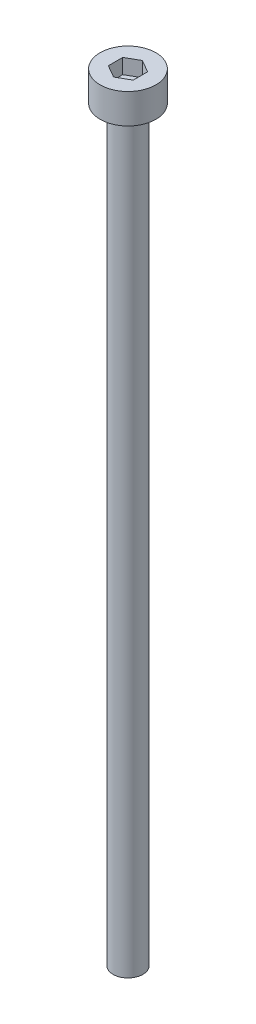
ISO-10303-21;
HEADER;
FILE_DESCRIPTION(('STEP AP214'),'2;1');
FILE_NAME('part.step','',(''),(''),'','','');
FILE_SCHEMA(('AUTOMOTIVE_DESIGN { 1 0 10303 214 1 1 1 1 }'));
ENDSEC;
DATA;
#1=APPLICATION_CONTEXT('core data for automotive mechanical design processes');
#2=APPLICATION_PROTOCOL_DEFINITION('international standard','automotive_design',2000,#1);
#3=PRODUCT_CONTEXT('',#1,'mechanical');
#4=PRODUCT('Part','Part','',(#3));
#5=PRODUCT_RELATED_PRODUCT_CATEGORY('part','',(#4));
#6=PRODUCT_DEFINITION_FORMATION('','',#4);
#7=PRODUCT_DEFINITION_CONTEXT('part definition',#1,'design');
#8=PRODUCT_DEFINITION('design','',#6,#7);
#9=PRODUCT_DEFINITION_SHAPE('','',#8);
#10=(LENGTH_UNIT() NAMED_UNIT(*) SI_UNIT(.MILLI.,.METRE.));
#11=(NAMED_UNIT(*) PLANE_ANGLE_UNIT() SI_UNIT($,.RADIAN.));
#12=(NAMED_UNIT(*) SI_UNIT($,.STERADIAN.) SOLID_ANGLE_UNIT());
#13=UNCERTAINTY_MEASURE_WITH_UNIT(LENGTH_MEASURE(1.E-05),#10,'distance_accuracy_value','');
#14=(GEOMETRIC_REPRESENTATION_CONTEXT(3) GLOBAL_UNCERTAINTY_ASSIGNED_CONTEXT((#13)) GLOBAL_UNIT_ASSIGNED_CONTEXT((#10,
#11,#12)) REPRESENTATION_CONTEXT('',''));
#15=CARTESIAN_POINT('',(0.,0.,0.));
#16=DIRECTION('',(0.,0.,1.));
#17=DIRECTION('',(1.,0.,0.));
#18=AXIS2_PLACEMENT_3D('',#15,#16,#17);
#19=CARTESIAN_POINT('',(0.,3.,0.));
#20=DIRECTION('',(0.,1.,0.));
#21=DIRECTION('',(0.,0.,1.));
#22=AXIS2_PLACEMENT_3D('',#19,#20,#21);
#23=PLANE('',#22);
#24=CARTESIAN_POINT('',(0.,3.,0.));
#25=DIRECTION('',(0.,1.,0.));
#26=DIRECTION('',(0.,0.,1.));
#27=AXIS2_PLACEMENT_3D('',#24,#25,#26);
#28=CIRCLE('',#27,2.8);
#29=CARTESIAN_POINT('',(0.,3.,2.8));
#30=VERTEX_POINT('',#29);
#31=EDGE_CURVE('E55',#30,#30,#28,.T.);
#32=ORIENTED_EDGE('',*,*,#31,.T.);
#33=EDGE_LOOP('',(#32));
#34=FACE_BOUND('',#33,.T.);
#35=DIRECTION('',(0.,0.,-1.));
#36=VECTOR('',#35,1.);
#37=CARTESIAN_POINT('',(1.25,3.,0.721687836487032));
#38=LINE('',#37,#36);
#39=CARTESIAN_POINT('',(1.25,3.,0.721687836487032));
#40=VERTEX_POINT('',#39);
#41=CARTESIAN_POINT('',(1.25,3.,-0.721687836487032));
#42=VERTEX_POINT('',#41);
#43=EDGE_CURVE('E135',#40,#42,#38,.T.);
#44=ORIENTED_EDGE('',*,*,#43,.F.);
#45=DIRECTION('',(0.866025403784439,0.,-0.5));
#46=VECTOR('',#45,1.);
#47=CARTESIAN_POINT('',(0.,3.,1.44337567297406));
#48=LINE('',#47,#46);
#49=CARTESIAN_POINT('',(0.,3.,1.44337567297406));
#50=VERTEX_POINT('',#49);
#51=EDGE_CURVE('E134',#50,#40,#48,.T.);
#52=ORIENTED_EDGE('',*,*,#51,.F.);
#53=DIRECTION('',(0.866025403784439,0.,0.5));
#54=VECTOR('',#53,1.);
#55=CARTESIAN_POINT('',(-1.25,3.,0.721687836487032));
#56=LINE('',#55,#54);
#57=CARTESIAN_POINT('',(-1.25,3.,0.721687836487032));
#58=VERTEX_POINT('',#57);
#59=EDGE_CURVE('E110',#58,#50,#56,.T.);
#60=ORIENTED_EDGE('',*,*,#59,.F.);
#61=DIRECTION('',(0.,0.,1.));
#62=VECTOR('',#61,1.);
#63=CARTESIAN_POINT('',(-1.25,3.,-0.721687836487032));
#64=LINE('',#63,#62);
#65=CARTESIAN_POINT('',(-1.25,3.,-0.721687836487032));
#66=VERTEX_POINT('',#65);
#67=EDGE_CURVE('E137',#66,#58,#64,.T.);
#68=ORIENTED_EDGE('',*,*,#67,.F.);
#69=DIRECTION('',(-0.866025403784439,0.,0.5));
#70=VECTOR('',#69,1.);
#71=CARTESIAN_POINT('',(0.,3.,-1.44337567297406));
#72=LINE('',#71,#70);
#73=CARTESIAN_POINT('',(0.,3.,-1.44337567297406));
#74=VERTEX_POINT('',#73);
#75=EDGE_CURVE('E136',#74,#66,#72,.T.);
#76=ORIENTED_EDGE('',*,*,#75,.F.);
#77=DIRECTION('',(-0.866025403784438,0.,-0.5));
#78=VECTOR('',#77,1.);
#79=CARTESIAN_POINT('',(1.25,3.,-0.721687836487032));
#80=LINE('',#79,#78);
#81=EDGE_CURVE('E138',#42,#74,#80,.T.);
#82=ORIENTED_EDGE('',*,*,#81,.F.);
#83=EDGE_LOOP('',(#44,#52,#60,#68,#76,#82));
#84=FACE_BOUND('',#83,.T.);
#85=ADVANCED_FACE('F43',(#34,#84),#23,.T.);
#86=CARTESIAN_POINT('',(0.,0.,0.));
#87=DIRECTION('',(0.,1.,0.));
#88=DIRECTION('',(0.,0.,1.));
#89=AXIS2_PLACEMENT_3D('',#86,#87,#88);
#90=PLANE('',#89);
#91=CARTESIAN_POINT('',(0.,0.,0.));
#92=DIRECTION('',(0.,-1.,0.));
#93=DIRECTION('',(0.,0.,-1.));
#94=AXIS2_PLACEMENT_3D('',#91,#92,#93);
#95=CIRCLE('',#94,1.5);
#96=CARTESIAN_POINT('',(0.,0.,-1.5));
#97=VERTEX_POINT('',#96);
#98=EDGE_CURVE('E11',#97,#97,#95,.T.);
#99=ORIENTED_EDGE('',*,*,#98,.F.);
#100=EDGE_LOOP('',(#99));
#101=FACE_BOUND('',#100,.T.);
#102=CARTESIAN_POINT('',(0.,0.,0.));
#103=DIRECTION('',(0.,1.,0.));
#104=DIRECTION('',(0.,0.,1.));
#105=AXIS2_PLACEMENT_3D('',#102,#103,#104);
#106=CIRCLE('',#105,2.8);
#107=CARTESIAN_POINT('',(0.,0.,2.8));
#108=VERTEX_POINT('',#107);
#109=EDGE_CURVE('E50',#108,#108,#106,.T.);
#110=ORIENTED_EDGE('',*,*,#109,.F.);
#111=EDGE_LOOP('',(#110));
#112=FACE_BOUND('',#111,.T.);
#113=ADVANCED_FACE('F157',(#101,#112),#90,.F.);
#114=CARTESIAN_POINT('',(0.,3.,0.));
#115=DIRECTION('',(0.,-1.,0.));
#116=DIRECTION('',(0.,0.,-1.));
#117=AXIS2_PLACEMENT_3D('',#114,#115,#116);
#118=CYLINDRICAL_SURFACE('',#117,2.8);
#119=ORIENTED_EDGE('',*,*,#31,.F.);
#120=EDGE_LOOP('',(#119));
#121=FACE_BOUND('',#120,.T.);
#122=ORIENTED_EDGE('',*,*,#109,.T.);
#123=EDGE_LOOP('',(#122));
#124=FACE_BOUND('',#123,.T.);
#125=ADVANCED_FACE('F44',(#121,#124),#118,.T.);
#126=CARTESIAN_POINT('',(0.,3.,1.44337567297406));
#127=DIRECTION('',(-0.5,0.,-0.866025403784438));
#128=DIRECTION('',(-0.866025403784439,0.,0.5));
#129=AXIS2_PLACEMENT_3D('',#126,#127,#128);
#130=PLANE('',#129);
#131=DIRECTION('',(0.866025403784439,0.,-0.5));
#132=VECTOR('',#131,1.);
#133=CARTESIAN_POINT('',(0.625,1.5,1.08253175473055));
#134=LINE('',#133,#132);
#135=CARTESIAN_POINT('',(0.,1.5,1.44337567297406));
#136=VERTEX_POINT('',#135);
#137=CARTESIAN_POINT('',(1.25,1.5,0.721687836487032));
#138=VERTEX_POINT('',#137);
#139=EDGE_CURVE('E114',#136,#138,#134,.T.);
#140=ORIENTED_EDGE('',*,*,#139,.F.);
#141=DIRECTION('',(0.,-1.,0.));
#142=VECTOR('',#141,1.);
#143=CARTESIAN_POINT('',(0.,3.,1.44337567297406));
#144=LINE('',#143,#142);
#145=EDGE_CURVE('E99',#50,#136,#144,.T.);
#146=ORIENTED_EDGE('',*,*,#145,.F.);
#147=ORIENTED_EDGE('',*,*,#51,.T.);
#148=DIRECTION('',(0.,-1.,0.));
#149=VECTOR('',#148,1.);
#150=CARTESIAN_POINT('',(1.25,3.,0.721687836487032));
#151=LINE('',#150,#149);
#152=EDGE_CURVE('E113',#40,#138,#151,.T.);
#153=ORIENTED_EDGE('',*,*,#152,.T.);
#154=EDGE_LOOP('',(#140,#146,#147,#153));
#155=FACE_BOUND('',#154,.T.);
#156=ADVANCED_FACE('F111',(#155),#130,.T.);
#157=CARTESIAN_POINT('',(1.25,3.,0.721687836487032));
#158=DIRECTION('',(-1.,0.,0.));
#159=DIRECTION('',(0.,0.,1.));
#160=AXIS2_PLACEMENT_3D('',#157,#158,#159);
#161=PLANE('',#160);
#162=DIRECTION('',(0.,0.,-1.));
#163=VECTOR('',#162,1.);
#164=CARTESIAN_POINT('',(1.25,1.5,0.));
#165=LINE('',#164,#163);
#166=CARTESIAN_POINT('',(1.25,1.5,-0.721687836487032));
#167=VERTEX_POINT('',#166);
#168=EDGE_CURVE('E58',#138,#167,#165,.T.);
#169=ORIENTED_EDGE('',*,*,#168,.F.);
#170=ORIENTED_EDGE('',*,*,#152,.F.);
#171=ORIENTED_EDGE('',*,*,#43,.T.);
#172=DIRECTION('',(0.,-1.,0.));
#173=VECTOR('',#172,1.);
#174=CARTESIAN_POINT('',(1.25,3.,-0.721687836487032));
#175=LINE('',#174,#173);
#176=EDGE_CURVE('E147',#42,#167,#175,.T.);
#177=ORIENTED_EDGE('',*,*,#176,.T.);
#178=EDGE_LOOP('',(#169,#170,#171,#177));
#179=FACE_BOUND('',#178,.T.);
#180=ADVANCED_FACE('F175',(#179),#161,.T.);
#181=CARTESIAN_POINT('',(1.25,3.,-0.721687836487032));
#182=DIRECTION('',(-0.5,0.,0.866025403784439));
#183=DIRECTION('',(0.866025403784439,0.,0.5));
#184=AXIS2_PLACEMENT_3D('',#181,#182,#183);
#185=PLANE('',#184);
#186=DIRECTION('',(-0.866025403784439,0.,-0.5));
#187=VECTOR('',#186,1.);
#188=CARTESIAN_POINT('',(0.625,1.5,-1.08253175473055));
#189=LINE('',#188,#187);
#190=CARTESIAN_POINT('',(0.,1.5,-1.44337567297406));
#191=VERTEX_POINT('',#190);
#192=EDGE_CURVE('E66',#167,#191,#189,.T.);
#193=ORIENTED_EDGE('',*,*,#192,.F.);
#194=ORIENTED_EDGE('',*,*,#176,.F.);
#195=ORIENTED_EDGE('',*,*,#81,.T.);
#196=DIRECTION('',(0.,-1.,0.));
#197=VECTOR('',#196,1.);
#198=CARTESIAN_POINT('',(0.,3.,-1.44337567297406));
#199=LINE('',#198,#197);
#200=EDGE_CURVE('E146',#74,#191,#199,.T.);
#201=ORIENTED_EDGE('',*,*,#200,.T.);
#202=EDGE_LOOP('',(#193,#194,#195,#201));
#203=FACE_BOUND('',#202,.T.);
#204=ADVANCED_FACE('F180',(#203),#185,.T.);
#205=CARTESIAN_POINT('',(0.,3.,-1.44337567297406));
#206=DIRECTION('',(0.5,0.,0.866025403784439));
#207=DIRECTION('',(0.866025403784439,0.,-0.5));
#208=AXIS2_PLACEMENT_3D('',#205,#206,#207);
#209=PLANE('',#208);
#210=DIRECTION('',(-0.866025403784439,0.,0.5));
#211=VECTOR('',#210,1.);
#212=CARTESIAN_POINT('',(-0.625,1.5,-1.08253175473055));
#213=LINE('',#212,#211);
#214=CARTESIAN_POINT('',(-1.25,1.5,-0.721687836487032));
#215=VERTEX_POINT('',#214);
#216=EDGE_CURVE('E129',#191,#215,#213,.T.);
#217=ORIENTED_EDGE('',*,*,#216,.F.);
#218=ORIENTED_EDGE('',*,*,#200,.F.);
#219=ORIENTED_EDGE('',*,*,#75,.T.);
#220=DIRECTION('',(0.,-1.,0.));
#221=VECTOR('',#220,1.);
#222=CARTESIAN_POINT('',(-1.25,3.,-0.721687836487032));
#223=LINE('',#222,#221);
#224=EDGE_CURVE('E144',#66,#215,#223,.T.);
#225=ORIENTED_EDGE('',*,*,#224,.T.);
#226=EDGE_LOOP('',(#217,#218,#219,#225));
#227=FACE_BOUND('',#226,.T.);
#228=ADVANCED_FACE('F177',(#227),#209,.T.);
#229=CARTESIAN_POINT('',(-1.25,3.,-0.721687836487032));
#230=DIRECTION('',(1.,0.,0.));
#231=DIRECTION('',(0.,0.,-1.));
#232=AXIS2_PLACEMENT_3D('',#229,#230,#231);
#233=PLANE('',#232);
#234=DIRECTION('',(0.,0.,1.));
#235=VECTOR('',#234,1.);
#236=CARTESIAN_POINT('',(-1.25,1.5,0.));
#237=LINE('',#236,#235);
#238=CARTESIAN_POINT('',(-1.25,1.5,0.721687836487032));
#239=VERTEX_POINT('',#238);
#240=EDGE_CURVE('E123',#215,#239,#237,.T.);
#241=ORIENTED_EDGE('',*,*,#240,.F.);
#242=ORIENTED_EDGE('',*,*,#224,.F.);
#243=ORIENTED_EDGE('',*,*,#67,.T.);
#244=DIRECTION('',(0.,-1.,0.));
#245=VECTOR('',#244,1.);
#246=CARTESIAN_POINT('',(-1.25,3.,0.721687836487032));
#247=LINE('',#246,#245);
#248=EDGE_CURVE('E109',#58,#239,#247,.T.);
#249=ORIENTED_EDGE('',*,*,#248,.T.);
#250=EDGE_LOOP('',(#241,#242,#243,#249));
#251=FACE_BOUND('',#250,.T.);
#252=ADVANCED_FACE('F181',(#251),#233,.T.);
#253=CARTESIAN_POINT('',(-1.25,3.,0.721687836487032));
#254=DIRECTION('',(0.5,0.,-0.866025403784438));
#255=DIRECTION('',(-0.866025403784439,0.,-0.5));
#256=AXIS2_PLACEMENT_3D('',#253,#254,#255);
#257=PLANE('',#256);
#258=DIRECTION('',(0.866025403784439,0.,0.5));
#259=VECTOR('',#258,1.);
#260=CARTESIAN_POINT('',(-0.625,1.5,1.08253175473055));
#261=LINE('',#260,#259);
#262=EDGE_CURVE('E102',#239,#136,#261,.T.);
#263=ORIENTED_EDGE('',*,*,#262,.F.);
#264=ORIENTED_EDGE('',*,*,#248,.F.);
#265=ORIENTED_EDGE('',*,*,#59,.T.);
#266=ORIENTED_EDGE('',*,*,#145,.T.);
#267=EDGE_LOOP('',(#263,#264,#265,#266));
#268=FACE_BOUND('',#267,.T.);
#269=ADVANCED_FACE('F105',(#268),#257,.T.);
#270=CARTESIAN_POINT('',(0.,1.5,0.));
#271=DIRECTION('',(0.,1.,0.));
#272=DIRECTION('',(0.,0.,1.));
#273=AXIS2_PLACEMENT_3D('',#270,#271,#272);
#274=PLANE('',#273);
#275=ORIENTED_EDGE('',*,*,#262,.T.);
#276=ORIENTED_EDGE('',*,*,#139,.T.);
#277=ORIENTED_EDGE('',*,*,#168,.T.);
#278=ORIENTED_EDGE('',*,*,#192,.T.);
#279=ORIENTED_EDGE('',*,*,#216,.T.);
#280=ORIENTED_EDGE('',*,*,#240,.T.);
#281=EDGE_LOOP('',(#275,#276,#277,#278,#279,#280));
#282=FACE_BOUND('',#281,.T.);
#283=ADVANCED_FACE('F120',(#282),#274,.T.);
#284=CARTESIAN_POINT('',(0.,-75.,0.));
#285=DIRECTION('',(0.,1.,0.));
#286=DIRECTION('',(0.,0.,1.));
#287=AXIS2_PLACEMENT_3D('',#284,#285,#286);
#288=CYLINDRICAL_SURFACE('',#287,1.5);
#289=CARTESIAN_POINT('',(0.,-75.,0.));
#290=DIRECTION('',(0.,-1.,0.));
#291=DIRECTION('',(0.,0.,-1.));
#292=AXIS2_PLACEMENT_3D('',#289,#290,#291);
#293=CIRCLE('',#292,1.5);
#294=CARTESIAN_POINT('',(0.,-75.,-1.5));
#295=VERTEX_POINT('',#294);
#296=EDGE_CURVE('E125',#295,#295,#293,.T.);
#297=ORIENTED_EDGE('',*,*,#296,.F.);
#298=EDGE_LOOP('',(#297));
#299=FACE_BOUND('',#298,.T.);
#300=ORIENTED_EDGE('',*,*,#98,.T.);
#301=EDGE_LOOP('',(#300));
#302=FACE_BOUND('',#301,.T.);
#303=ADVANCED_FACE('F193',(#299,#302),#288,.T.);
#304=CARTESIAN_POINT('',(0.,-75.,0.));
#305=DIRECTION('',(0.,-1.,0.));
#306=DIRECTION('',(0.,0.,-1.));
#307=AXIS2_PLACEMENT_3D('',#304,#305,#306);
#308=PLANE('',#307);
#309=ORIENTED_EDGE('',*,*,#296,.T.);
#310=EDGE_LOOP('',(#309));
#311=FACE_BOUND('',#310,.T.);
#312=ADVANCED_FACE('F191',(#311),#308,.T.);
#313=CLOSED_SHELL('',(#85,#113,#125,#156,#180,#204,#228,#252,#269,#283,#303,#312));
#314=MANIFOLD_SOLID_BREP('B2',#313);
#315=ADVANCED_BREP_SHAPE_REPRESENTATION('',(#18,#314),#14);
#316=SHAPE_DEFINITION_REPRESENTATION(#9,#315);
ENDSEC;
END-ISO-10303-21;
